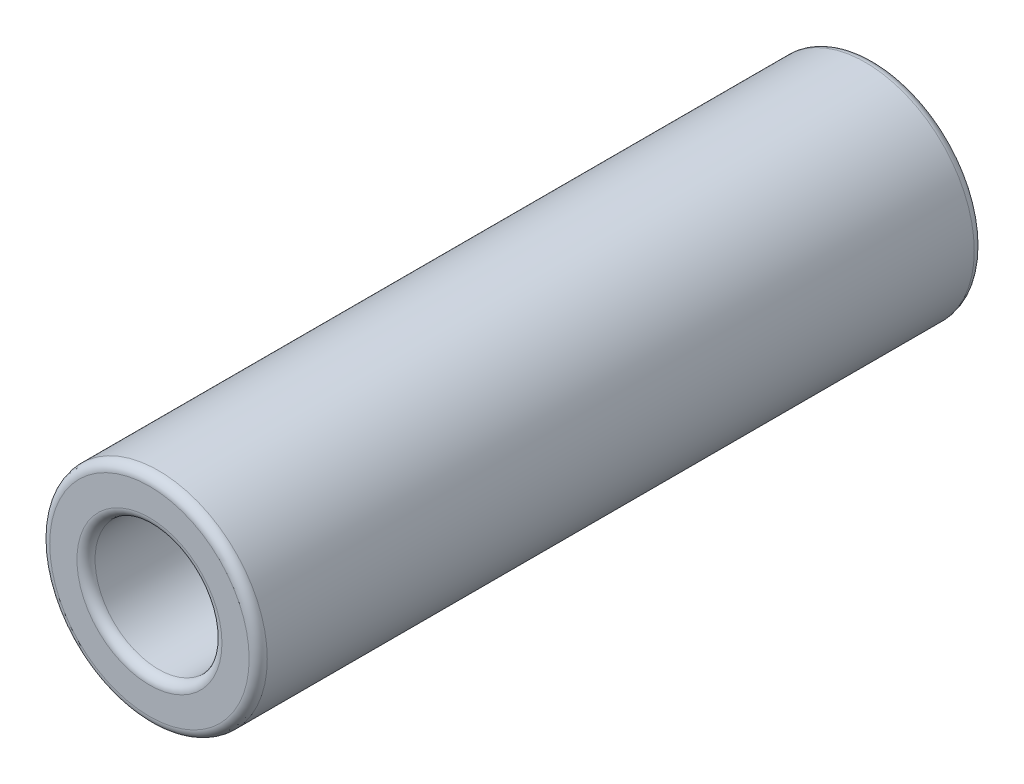
ISO-10303-21;
HEADER;
FILE_DESCRIPTION(('STEP AP214'),'2;1');
FILE_NAME('part.step','',(''),(''),'','','');
FILE_SCHEMA(('AUTOMOTIVE_DESIGN { 1 0 10303 214 1 1 1 1 }'));
ENDSEC;
DATA;
#1=APPLICATION_CONTEXT('core data for automotive mechanical design processes');
#2=APPLICATION_PROTOCOL_DEFINITION('international standard','automotive_design',2000,#1);
#3=PRODUCT_CONTEXT('',#1,'mechanical');
#4=PRODUCT('Part','Part','',(#3));
#5=PRODUCT_RELATED_PRODUCT_CATEGORY('part','',(#4));
#6=PRODUCT_DEFINITION_FORMATION('','',#4);
#7=PRODUCT_DEFINITION_CONTEXT('part definition',#1,'design');
#8=PRODUCT_DEFINITION('design','',#6,#7);
#9=PRODUCT_DEFINITION_SHAPE('','',#8);
#10=(LENGTH_UNIT() NAMED_UNIT(*) SI_UNIT(.MILLI.,.METRE.));
#11=(NAMED_UNIT(*) PLANE_ANGLE_UNIT() SI_UNIT($,.RADIAN.));
#12=(NAMED_UNIT(*) SI_UNIT($,.STERADIAN.) SOLID_ANGLE_UNIT());
#13=UNCERTAINTY_MEASURE_WITH_UNIT(LENGTH_MEASURE(1.E-05),#10,'distance_accuracy_value','');
#14=(GEOMETRIC_REPRESENTATION_CONTEXT(3) GLOBAL_UNCERTAINTY_ASSIGNED_CONTEXT((#13)) GLOBAL_UNIT_ASSIGNED_CONTEXT((#10,
#11,#12)) REPRESENTATION_CONTEXT('',''));
#15=CARTESIAN_POINT('',(0.,0.,0.));
#16=DIRECTION('',(0.,0.,1.));
#17=DIRECTION('',(1.,0.,0.));
#18=AXIS2_PLACEMENT_3D('',#15,#16,#17);
#19=CARTESIAN_POINT('',(0.,0.,40.));
#20=DIRECTION('',(0.,0.,1.));
#21=DIRECTION('',(1.,0.,0.));
#22=AXIS2_PLACEMENT_3D('',#19,#20,#21);
#23=PLANE('',#22);
#24=CARTESIAN_POINT('',(0.,0.,40.));
#25=DIRECTION('',(0.,0.,1.));
#26=DIRECTION('',(1.,0.,0.));
#27=AXIS2_PLACEMENT_3D('',#24,#25,#26);
#28=CIRCLE('',#27,4.);
#29=CARTESIAN_POINT('',(4.,0.,40.));
#30=VERTEX_POINT('',#29);
#31=EDGE_CURVE('E10',#30,#30,#28,.F.);
#32=ORIENTED_EDGE('',*,*,#31,.T.);
#33=EDGE_LOOP('',(#32));
#34=FACE_BOUND('',#33,.T.);
#35=CARTESIAN_POINT('',(0.,0.,40.));
#36=DIRECTION('',(0.,0.,1.));
#37=DIRECTION('',(1.,0.,0.));
#38=AXIS2_PLACEMENT_3D('',#35,#36,#37);
#39=CIRCLE('',#38,5.5);
#40=CARTESIAN_POINT('',(5.5,0.,40.));
#41=VERTEX_POINT('',#40);
#42=EDGE_CURVE('E49',#41,#41,#39,.T.);
#43=ORIENTED_EDGE('',*,*,#42,.T.);
#44=EDGE_LOOP('',(#43));
#45=FACE_BOUND('',#44,.T.);
#46=ADVANCED_FACE('F41',(#34,#45),#23,.T.);
#47=CARTESIAN_POINT('',(0.,0.,0.));
#48=DIRECTION('',(0.,0.,1.));
#49=DIRECTION('',(1.,0.,0.));
#50=AXIS2_PLACEMENT_3D('',#47,#48,#49);
#51=PLANE('',#50);
#52=CARTESIAN_POINT('',(0.,0.,0.));
#53=DIRECTION('',(0.,0.,1.));
#54=DIRECTION('',(1.,0.,0.));
#55=AXIS2_PLACEMENT_3D('',#52,#53,#54);
#56=CIRCLE('',#55,5.5);
#57=CARTESIAN_POINT('',(5.5,0.,0.));
#58=VERTEX_POINT('',#57);
#59=EDGE_CURVE('E65',#58,#58,#56,.F.);
#60=ORIENTED_EDGE('',*,*,#59,.T.);
#61=EDGE_LOOP('',(#60));
#62=FACE_BOUND('',#61,.T.);
#63=CARTESIAN_POINT('',(0.,0.,0.));
#64=DIRECTION('',(0.,0.,1.));
#65=DIRECTION('',(1.,0.,0.));
#66=AXIS2_PLACEMENT_3D('',#63,#64,#65);
#67=CIRCLE('',#66,4.);
#68=CARTESIAN_POINT('',(4.,0.,0.));
#69=VERTEX_POINT('',#68);
#70=EDGE_CURVE('E69',#69,#69,#67,.T.);
#71=ORIENTED_EDGE('',*,*,#70,.T.);
#72=EDGE_LOOP('',(#71));
#73=FACE_BOUND('',#72,.T.);
#74=ADVANCED_FACE('F93',(#62,#73),#51,.F.);
#75=CARTESIAN_POINT('',(0.,0.,40.));
#76=DIRECTION('',(0.,0.,-1.));
#77=DIRECTION('',(-1.,0.,0.));
#78=AXIS2_PLACEMENT_3D('',#75,#76,#77);
#79=CYLINDRICAL_SURFACE('',#78,6.);
#80=CARTESIAN_POINT('',(0.,0.,0.5));
#81=DIRECTION('',(0.,0.,1.));
#82=DIRECTION('',(1.,0.,0.));
#83=AXIS2_PLACEMENT_3D('',#80,#81,#82);
#84=CIRCLE('',#83,6.);
#85=CARTESIAN_POINT('',(6.,0.,0.5));
#86=VERTEX_POINT('',#85);
#87=EDGE_CURVE('E73',#86,#86,#84,.T.);
#88=ORIENTED_EDGE('',*,*,#87,.T.);
#89=EDGE_LOOP('',(#88));
#90=FACE_BOUND('',#89,.T.);
#91=CARTESIAN_POINT('',(0.,0.,39.5));
#92=DIRECTION('',(0.,0.,1.));
#93=DIRECTION('',(1.,0.,0.));
#94=AXIS2_PLACEMENT_3D('',#91,#92,#93);
#95=CIRCLE('',#94,6.);
#96=CARTESIAN_POINT('',(6.,0.,39.5));
#97=VERTEX_POINT('',#96);
#98=EDGE_CURVE('E77',#97,#97,#95,.F.);
#99=ORIENTED_EDGE('',*,*,#98,.T.);
#100=EDGE_LOOP('',(#99));
#101=FACE_BOUND('',#100,.T.);
#102=ADVANCED_FACE('F82',(#90,#101),#79,.T.);
#103=CARTESIAN_POINT('',(0.,0.,40.));
#104=DIRECTION('',(0.,0.,-1.));
#105=DIRECTION('',(-1.,0.,0.));
#106=AXIS2_PLACEMENT_3D('',#103,#104,#105);
#107=CYLINDRICAL_SURFACE('',#106,3.5);
#108=CARTESIAN_POINT('',(0.,0.,0.5));
#109=DIRECTION('',(0.,0.,1.));
#110=DIRECTION('',(1.,0.,0.));
#111=AXIS2_PLACEMENT_3D('',#108,#109,#110);
#112=CIRCLE('',#111,3.5);
#113=CARTESIAN_POINT('',(3.5,0.,0.5));
#114=VERTEX_POINT('',#113);
#115=EDGE_CURVE('E54',#114,#114,#112,.F.);
#116=ORIENTED_EDGE('',*,*,#115,.T.);
#117=EDGE_LOOP('',(#116));
#118=FACE_BOUND('',#117,.T.);
#119=CARTESIAN_POINT('',(0.,0.,39.5));
#120=DIRECTION('',(0.,0.,1.));
#121=DIRECTION('',(1.,0.,0.));
#122=AXIS2_PLACEMENT_3D('',#119,#120,#121);
#123=CIRCLE('',#122,3.5);
#124=CARTESIAN_POINT('',(3.5,0.,39.5));
#125=VERTEX_POINT('',#124);
#126=EDGE_CURVE('E59',#125,#125,#123,.T.);
#127=ORIENTED_EDGE('',*,*,#126,.T.);
#128=EDGE_LOOP('',(#127));
#129=FACE_BOUND('',#128,.T.);
#130=ADVANCED_FACE('F101',(#118,#129),#107,.F.);
#131=CARTESIAN_POINT('',(0.,0.,0.5));
#132=DIRECTION('',(0.,0.,1.));
#133=DIRECTION('',(1.,0.,0.));
#134=AXIS2_PLACEMENT_3D('',#131,#132,#133);
#135=TOROIDAL_SURFACE('',#134,5.5,0.5);
#136=ORIENTED_EDGE('',*,*,#59,.F.);
#137=EDGE_LOOP('',(#136));
#138=FACE_BOUND('',#137,.T.);
#139=ORIENTED_EDGE('',*,*,#87,.F.);
#140=EDGE_LOOP('',(#139));
#141=FACE_BOUND('',#140,.T.);
#142=ADVANCED_FACE('F106',(#138,#141),#135,.T.);
#143=CARTESIAN_POINT('',(0.,0.,0.5));
#144=DIRECTION('',(0.,0.,1.));
#145=DIRECTION('',(1.,0.,0.));
#146=AXIS2_PLACEMENT_3D('',#143,#144,#145);
#147=TOROIDAL_SURFACE('',#146,4.,0.5);
#148=ORIENTED_EDGE('',*,*,#115,.F.);
#149=EDGE_LOOP('',(#148));
#150=FACE_BOUND('',#149,.T.);
#151=ORIENTED_EDGE('',*,*,#70,.F.);
#152=EDGE_LOOP('',(#151));
#153=FACE_BOUND('',#152,.T.);
#154=ADVANCED_FACE('F90',(#150,#153),#147,.T.);
#155=CARTESIAN_POINT('',(0.,0.,39.5));
#156=DIRECTION('',(0.,0.,1.));
#157=DIRECTION('',(1.,0.,0.));
#158=AXIS2_PLACEMENT_3D('',#155,#156,#157);
#159=TOROIDAL_SURFACE('',#158,4.,0.5);
#160=ORIENTED_EDGE('',*,*,#31,.F.);
#161=EDGE_LOOP('',(#160));
#162=FACE_BOUND('',#161,.T.);
#163=ORIENTED_EDGE('',*,*,#126,.F.);
#164=EDGE_LOOP('',(#163));
#165=FACE_BOUND('',#164,.T.);
#166=ADVANCED_FACE('F86',(#162,#165),#159,.T.);
#167=CARTESIAN_POINT('',(0.,0.,39.5));
#168=DIRECTION('',(0.,0.,1.));
#169=DIRECTION('',(1.,0.,0.));
#170=AXIS2_PLACEMENT_3D('',#167,#168,#169);
#171=TOROIDAL_SURFACE('',#170,5.5,0.5);
#172=ORIENTED_EDGE('',*,*,#98,.F.);
#173=EDGE_LOOP('',(#172));
#174=FACE_BOUND('',#173,.T.);
#175=ORIENTED_EDGE('',*,*,#42,.F.);
#176=EDGE_LOOP('',(#175));
#177=FACE_BOUND('',#176,.T.);
#178=ADVANCED_FACE('F43',(#174,#177),#171,.T.);
#179=CLOSED_SHELL('',(#46,#74,#102,#130,#142,#154,#166,#178));
#180=MANIFOLD_SOLID_BREP('B2',#179);
#181=ADVANCED_BREP_SHAPE_REPRESENTATION('',(#18,#180),#14);
#182=SHAPE_DEFINITION_REPRESENTATION(#9,#181);
ENDSEC;
END-ISO-10303-21;
